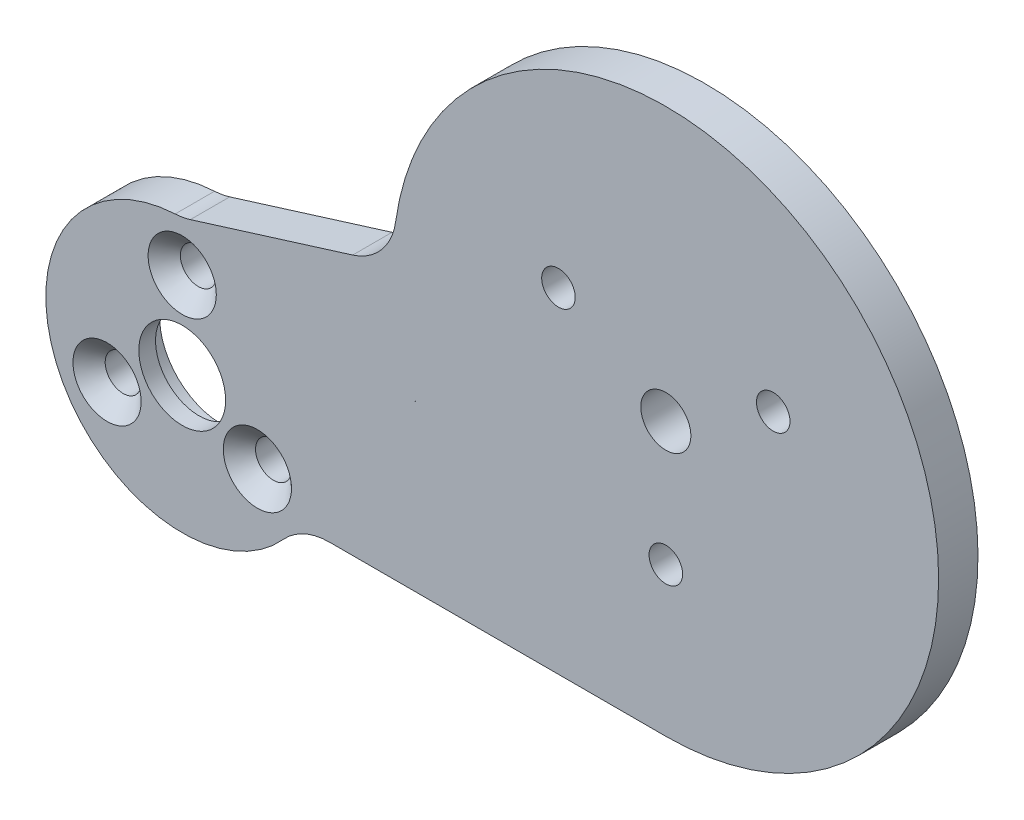
ISO-10303-21;
HEADER;
FILE_DESCRIPTION(('STEP AP214'),'2;1');
FILE_NAME('part.step','',(''),(''),'','','');
FILE_SCHEMA(('AUTOMOTIVE_DESIGN { 1 0 10303 214 1 1 1 1 }'));
ENDSEC;
DATA;
#1=APPLICATION_CONTEXT('core data for automotive mechanical design processes');
#2=APPLICATION_PROTOCOL_DEFINITION('international standard','automotive_design',2000,#1);
#3=PRODUCT_CONTEXT('',#1,'mechanical');
#4=PRODUCT('Part','Part','',(#3));
#5=PRODUCT_RELATED_PRODUCT_CATEGORY('part','',(#4));
#6=PRODUCT_DEFINITION_FORMATION('','',#4);
#7=PRODUCT_DEFINITION_CONTEXT('part definition',#1,'design');
#8=PRODUCT_DEFINITION('design','',#6,#7);
#9=PRODUCT_DEFINITION_SHAPE('','',#8);
#10=(LENGTH_UNIT() NAMED_UNIT(*) SI_UNIT(.MILLI.,.METRE.));
#11=(NAMED_UNIT(*) PLANE_ANGLE_UNIT() SI_UNIT($,.RADIAN.));
#12=(NAMED_UNIT(*) SI_UNIT($,.STERADIAN.) SOLID_ANGLE_UNIT());
#13=UNCERTAINTY_MEASURE_WITH_UNIT(LENGTH_MEASURE(1.E-05),#10,'distance_accuracy_value','');
#14=(GEOMETRIC_REPRESENTATION_CONTEXT(3) GLOBAL_UNCERTAINTY_ASSIGNED_CONTEXT((#13)) GLOBAL_UNIT_ASSIGNED_CONTEXT((#10,
#11,#12)) REPRESENTATION_CONTEXT('',''));
#15=CARTESIAN_POINT('',(0.,0.,0.));
#16=DIRECTION('',(0.,0.,1.));
#17=DIRECTION('',(1.,0.,0.));
#18=AXIS2_PLACEMENT_3D('',#15,#16,#17);
#19=CARTESIAN_POINT('',(-17.3832645273717,-89.6793573994371,0.));
#20=DIRECTION('',(0.,0.,1.));
#21=DIRECTION('',(1.,0.,0.));
#22=AXIS2_PLACEMENT_3D('',#19,#20,#21);
#23=PLANE('',#22);
#24=CARTESIAN_POINT('',(0.,0.,0.));
#25=DIRECTION('',(0.,0.,1.));
#26=DIRECTION('',(1.,0.,0.));
#27=AXIS2_PLACEMENT_3D('',#24,#25,#26);
#28=CIRCLE('',#27,22.);
#29=CARTESIAN_POINT('',(0.,-22.,0.));
#30=VERTEX_POINT('',#29);
#31=CARTESIAN_POINT('',(-21.7852816497418,3.06618711780979,0.));
#32=VERTEX_POINT('',#31);
#33=EDGE_CURVE('E166',#30,#32,#28,.T.);
#34=ORIENTED_EDGE('',*,*,#33,.F.);
#35=DIRECTION('',(-1.,0.,0.));
#36=VECTOR('',#35,1.);
#37=CARTESIAN_POINT('',(-17.3832645273717,-22.,0.));
#38=LINE('',#37,#36);
#39=CARTESIAN_POINT('',(-27.1153021330291,-22.,0.));
#40=VERTEX_POINT('',#39);
#41=EDGE_CURVE('E136',#30,#40,#38,.T.);
#42=ORIENTED_EDGE('',*,*,#41,.T.);
#43=CARTESIAN_POINT('',(-27.1153021330291,-27.,0.));
#44=DIRECTION('',(0.,0.,1.));
#45=DIRECTION('',(1.,0.,0.));
#46=AXIS2_PLACEMENT_3D('',#43,#44,#45);
#47=CIRCLE('',#46,5.);
#48=CARTESIAN_POINT('',(-30.8292702164575,-23.6523977125,0.));
#49=VERTEX_POINT('',#48);
#50=EDGE_CURVE('E188',#40,#49,#47,.T.);
#51=ORIENTED_EDGE('',*,*,#50,.T.);
#52=CARTESIAN_POINT('',(-39.,-16.28767268,0.));
#53=DIRECTION('',(0.,0.,1.));
#54=DIRECTION('',(1.,0.,0.));
#55=AXIS2_PLACEMENT_3D('',#52,#53,#54);
#56=CIRCLE('',#55,11.);
#57=CARTESIAN_POINT('',(-39.5697254592245,-5.30243654684786,0.));
#58=VERTEX_POINT('',#57);
#59=EDGE_CURVE('E139',#58,#49,#56,.T.);
#60=ORIENTED_EDGE('',*,*,#59,.F.);
#61=CARTESIAN_POINT('',(-39.8286915770539,-0.309147395415074,0.));
#62=DIRECTION('',(0.,0.,1.));
#63=DIRECTION('',(1.,0.,0.));
#64=AXIS2_PLACEMENT_3D('',#61,#62,#63);
#65=CIRCLE('',#64,5.);
#66=CARTESIAN_POINT('',(-38.3436702415299,-5.08352815453333,0.));
#67=VERTEX_POINT('',#66);
#68=EDGE_CURVE('E192',#58,#67,#65,.T.);
#69=ORIENTED_EDGE('',*,*,#68,.T.);
#70=DIRECTION('',(0.954876151823652,0.297004267104792,0.));
#71=VECTOR('',#70,1.);
#72=CARTESIAN_POINT('',(-43.2237851206375,-6.6014369852109,0.));
#73=LINE('',#72,#71);
#74=CARTESIAN_POINT('',(-25.2514606891592,-1.01133293271534,0.));
#75=VERTEX_POINT('',#74);
#76=EDGE_CURVE('E167',#67,#75,#73,.T.);
#77=ORIENTED_EDGE('',*,*,#76,.T.);
#78=CARTESIAN_POINT('',(-26.7364820246831,3.76304782640292,0.));
#79=DIRECTION('',(0.,0.,1.));
#80=DIRECTION('',(1.,0.,0.));
#81=AXIS2_PLACEMENT_3D('',#78,#79,#80);
#82=CIRCLE('',#81,5.);
#83=EDGE_CURVE('E44',#75,#32,#82,.T.);
#84=ORIENTED_EDGE('',*,*,#83,.T.);
#85=EDGE_LOOP('',(#34,#42,#51,#60,#69,#77,#84));
#86=FACE_BOUND('',#85,.T.);
#87=DIRECTION('',(0.0701321385229143,0.997537710137418,0.));
#88=VECTOR('',#87,1.);
#89=CARTESIAN_POINT('',(-25.8026304356718,-89.0874317708063,0.));
#90=LINE('',#89,#88);
#91=CARTESIAN_POINT('',(-20.1597441083789,-8.8247729663224,0.));
#92=VERTEX_POINT('',#91);
#93=CARTESIAN_POINT('',(-20.1587415560869,-8.81051297456019,0.));
#94=VERTEX_POINT('',#93);
#95=EDGE_CURVE('E119',#92,#94,#90,.T.);
#96=ORIENTED_EDGE('',*,*,#95,.T.);
#97=CARTESIAN_POINT('',(-20.3007233704013,-8.47824454934163,0.));
#98=VERTEX_POINT('',#97);
#99=EDGE_CURVE('E163',#98,#94,#28,.T.);
#100=ORIENTED_EDGE('',*,*,#99,.F.);
#101=CARTESIAN_POINT('',(-39.,-16.28767268,0.));
#102=DIRECTION('',(0.,0.,1.));
#103=DIRECTION('',(1.,0.,0.));
#104=AXIS2_PLACEMENT_3D('',#101,#102,#103);
#105=CIRCLE('',#104,20.2645037984692);
#106=EDGE_CURVE('E161',#92,#98,#105,.T.);
#107=ORIENTED_EDGE('',*,*,#106,.F.);
#108=EDGE_LOOP('',(#96,#100,#107));
#109=FACE_BOUND('',#108,.T.);
#110=CARTESIAN_POINT('',(-32.9378221735089,-19.78767268,0.));
#111=DIRECTION('',(0.,0.,1.));
#112=DIRECTION('',(1.,0.,0.));
#113=AXIS2_PLACEMENT_3D('',#110,#111,#112);
#114=CIRCLE('',#113,1.45);
#115=CARTESIAN_POINT('',(-31.4878221735089,-19.78767268,0.));
#116=VERTEX_POINT('',#115);
#117=EDGE_CURVE('E142',#116,#116,#114,.T.);
#118=ORIENTED_EDGE('',*,*,#117,.T.);
#119=EDGE_LOOP('',(#118));
#120=FACE_BOUND('',#119,.T.);
#121=CARTESIAN_POINT('',(-45.0621778264911,-19.78767268,0.));
#122=DIRECTION('',(0.,0.,1.));
#123=DIRECTION('',(1.,0.,0.));
#124=AXIS2_PLACEMENT_3D('',#121,#122,#123);
#125=CIRCLE('',#124,1.45);
#126=CARTESIAN_POINT('',(-43.612177826491,-19.78767268,0.));
#127=VERTEX_POINT('',#126);
#128=EDGE_CURVE('E554',#127,#127,#125,.T.);
#129=ORIENTED_EDGE('',*,*,#128,.T.);
#130=EDGE_LOOP('',(#129));
#131=FACE_BOUND('',#130,.T.);
#132=CARTESIAN_POINT('',(-39.,-9.28767268000001,0.));
#133=DIRECTION('',(0.,0.,1.));
#134=DIRECTION('',(1.,0.,0.));
#135=AXIS2_PLACEMENT_3D('',#132,#133,#134);
#136=CIRCLE('',#135,1.45);
#137=CARTESIAN_POINT('',(-37.55,-9.28767268000001,0.));
#138=VERTEX_POINT('',#137);
#139=EDGE_CURVE('E545',#138,#138,#136,.T.);
#140=ORIENTED_EDGE('',*,*,#139,.T.);
#141=EDGE_LOOP('',(#140));
#142=FACE_BOUND('',#141,.T.);
#143=CARTESIAN_POINT('',(0.,0.,0.));
#144=DIRECTION('',(0.,0.,1.));
#145=DIRECTION('',(1.,0.,0.));
#146=AXIS2_PLACEMENT_3D('',#143,#144,#145);
#147=CIRCLE('',#146,2.01929999999999);
#148=CARTESIAN_POINT('',(2.01929999999999,0.,0.));
#149=VERTEX_POINT('',#148);
#150=EDGE_CURVE('E536',#149,#149,#147,.T.);
#151=ORIENTED_EDGE('',*,*,#150,.T.);
#152=EDGE_LOOP('',(#151));
#153=FACE_BOUND('',#152,.T.);
#154=CARTESIAN_POINT('',(0.,-10.,0.));
#155=DIRECTION('',(0.,0.,-1.));
#156=DIRECTION('',(-1.,0.,0.));
#157=AXIS2_PLACEMENT_3D('',#154,#155,#156);
#158=CIRCLE('',#157,1.35254999999999);
#159=CARTESIAN_POINT('',(-1.35254999999999,-10.,0.));
#160=VERTEX_POINT('',#159);
#161=EDGE_CURVE('E527',#160,#160,#158,.T.);
#162=ORIENTED_EDGE('',*,*,#161,.F.);
#163=EDGE_LOOP('',(#162));
#164=FACE_BOUND('',#163,.T.);
#165=CARTESIAN_POINT('',(8.66025403784436,5.00000000000004,0.));
#166=DIRECTION('',(0.,0.,-1.));
#167=DIRECTION('',(-1.,0.,0.));
#168=AXIS2_PLACEMENT_3D('',#165,#166,#167);
#169=CIRCLE('',#168,1.35254999999999);
#170=CARTESIAN_POINT('',(7.30770403784437,5.00000000000004,0.));
#171=VERTEX_POINT('',#170);
#172=EDGE_CURVE('E521',#171,#171,#169,.T.);
#173=ORIENTED_EDGE('',*,*,#172,.F.);
#174=EDGE_LOOP('',(#173));
#175=FACE_BOUND('',#174,.T.);
#176=CARTESIAN_POINT('',(-8.66025403784436,5.00000000000004,0.));
#177=DIRECTION('',(0.,0.,-1.));
#178=DIRECTION('',(-1.,0.,0.));
#179=AXIS2_PLACEMENT_3D('',#176,#177,#178);
#180=CIRCLE('',#179,1.35254999999999);
#181=CARTESIAN_POINT('',(-10.0128040378444,5.00000000000004,0.));
#182=VERTEX_POINT('',#181);
#183=EDGE_CURVE('E509',#182,#182,#180,.T.);
#184=ORIENTED_EDGE('',*,*,#183,.F.);
#185=EDGE_LOOP('',(#184));
#186=FACE_BOUND('',#185,.T.);
#187=CARTESIAN_POINT('',(-39.,-16.28767268,0.));
#188=DIRECTION('',(0.,0.,1.));
#189=DIRECTION('',(1.,0.,0.));
#190=AXIS2_PLACEMENT_3D('',#187,#188,#189);
#191=CIRCLE('',#190,5.);
#192=CARTESIAN_POINT('',(-34.,-16.28767268,0.));
#193=VERTEX_POINT('',#192);
#194=EDGE_CURVE('E514',#193,#193,#191,.T.);
#195=ORIENTED_EDGE('',*,*,#194,.T.);
#196=EDGE_LOOP('',(#195));
#197=FACE_BOUND('',#196,.T.);
#198=ADVANCED_FACE('F36',(#86,#109,#120,#131,#142,#153,#164,#175,#186,#197),#23,.F.);
#199=CARTESIAN_POINT('',(0.,0.,3.175));
#200=DIRECTION('',(0.,0.,-1.));
#201=DIRECTION('',(-1.,0.,0.));
#202=AXIS2_PLACEMENT_3D('',#199,#200,#201);
#203=CYLINDRICAL_SURFACE('',#202,22.);
#204=ORIENTED_EDGE('',*,*,#33,.T.);
#205=DIRECTION('',(0.,0.,-1.));
#206=VECTOR('',#205,1.);
#207=CARTESIAN_POINT('',(-21.7852816497418,3.06618711780979,3.175));
#208=LINE('',#207,#206);
#209=CARTESIAN_POINT('',(-21.7852816497418,3.06618711780979,3.175));
#210=VERTEX_POINT('',#209);
#211=EDGE_CURVE('E51',#32,#210,#208,.F.);
#212=ORIENTED_EDGE('',*,*,#211,.T.);
#213=CARTESIAN_POINT('',(0.,0.,3.175));
#214=DIRECTION('',(0.,0.,1.));
#215=DIRECTION('',(1.,0.,0.));
#216=AXIS2_PLACEMENT_3D('',#213,#214,#215);
#217=CIRCLE('',#216,22.);
#218=CARTESIAN_POINT('',(0.,-22.,3.175));
#219=VERTEX_POINT('',#218);
#220=EDGE_CURVE('E146',#219,#210,#217,.T.);
#221=ORIENTED_EDGE('',*,*,#220,.F.);
#222=DIRECTION('',(0.,0.,-1.));
#223=VECTOR('',#222,1.);
#224=CARTESIAN_POINT('',(0.,-22.,3.175));
#225=LINE('',#224,#223);
#226=EDGE_CURVE('E122',#219,#30,#225,.T.);
#227=ORIENTED_EDGE('',*,*,#226,.T.);
#228=EDGE_LOOP('',(#204,#212,#221,#227));
#229=FACE_BOUND('',#228,.T.);
#230=ADVANCED_FACE('F216',(#229),#203,.T.);
#231=CARTESIAN_POINT('',(-43.2237851206375,-6.6014369852109,3.175));
#232=DIRECTION('',(-0.297004267104792,0.954876151823652,0.));
#233=DIRECTION('',(-0.954876151823652,-0.297004267104792,0.));
#234=AXIS2_PLACEMENT_3D('',#231,#232,#233);
#235=PLANE('',#234);
#236=ORIENTED_EDGE('',*,*,#76,.F.);
#237=DIRECTION('',(0.,0.,-1.));
#238=VECTOR('',#237,1.);
#239=CARTESIAN_POINT('',(-38.3436702415299,-5.08352815453333,3.175));
#240=LINE('',#239,#238);
#241=CARTESIAN_POINT('',(-38.3436702415299,-5.08352815453333,3.175));
#242=VERTEX_POINT('',#241);
#243=EDGE_CURVE('E185',#67,#242,#240,.F.);
#244=ORIENTED_EDGE('',*,*,#243,.T.);
#245=DIRECTION('',(0.954876151823652,0.297004267104792,0.));
#246=VECTOR('',#245,1.);
#247=CARTESIAN_POINT('',(-43.2237851206375,-6.6014369852109,3.175));
#248=LINE('',#247,#246);
#249=CARTESIAN_POINT('',(-25.2514606891592,-1.01133293271534,3.175));
#250=VERTEX_POINT('',#249);
#251=EDGE_CURVE('E147',#242,#250,#248,.T.);
#252=ORIENTED_EDGE('',*,*,#251,.T.);
#253=DIRECTION('',(0.,0.,-1.));
#254=VECTOR('',#253,1.);
#255=CARTESIAN_POINT('',(-25.2514606891592,-1.01133293271534,3.175));
#256=LINE('',#255,#254);
#257=EDGE_CURVE('E182',#250,#75,#256,.T.);
#258=ORIENTED_EDGE('',*,*,#257,.T.);
#259=EDGE_LOOP('',(#236,#244,#252,#258));
#260=FACE_BOUND('',#259,.T.);
#261=ADVANCED_FACE('F211',(#260),#235,.T.);
#262=CARTESIAN_POINT('',(-39.,-16.28767268,3.175));
#263=DIRECTION('',(0.,0.,-1.));
#264=DIRECTION('',(-1.,0.,0.));
#265=AXIS2_PLACEMENT_3D('',#262,#263,#264);
#266=CYLINDRICAL_SURFACE('',#265,11.);
#267=ORIENTED_EDGE('',*,*,#59,.T.);
#268=DIRECTION('',(0.,0.,-1.));
#269=VECTOR('',#268,1.);
#270=CARTESIAN_POINT('',(-30.8292702164575,-23.6523977125,3.175));
#271=LINE('',#270,#269);
#272=CARTESIAN_POINT('',(-30.8292702164575,-23.6523977125,3.175));
#273=VERTEX_POINT('',#272);
#274=EDGE_CURVE('E180',#49,#273,#271,.F.);
#275=ORIENTED_EDGE('',*,*,#274,.T.);
#276=CARTESIAN_POINT('',(-39.,-16.28767268,3.175));
#277=DIRECTION('',(0.,0.,1.));
#278=DIRECTION('',(1.,0.,0.));
#279=AXIS2_PLACEMENT_3D('',#276,#277,#278);
#280=CIRCLE('',#279,11.);
#281=CARTESIAN_POINT('',(-39.5697254592245,-5.30243654684786,3.175));
#282=VERTEX_POINT('',#281);
#283=EDGE_CURVE('E150',#282,#273,#280,.T.);
#284=ORIENTED_EDGE('',*,*,#283,.F.);
#285=DIRECTION('',(0.,0.,-1.));
#286=VECTOR('',#285,1.);
#287=CARTESIAN_POINT('',(-39.5697254592245,-5.30243654684786,3.175));
#288=LINE('',#287,#286);
#289=EDGE_CURVE('E177',#282,#58,#288,.T.);
#290=ORIENTED_EDGE('',*,*,#289,.T.);
#291=EDGE_LOOP('',(#267,#275,#284,#290));
#292=FACE_BOUND('',#291,.T.);
#293=ADVANCED_FACE('F204',(#292),#266,.T.);
#294=CARTESIAN_POINT('',(-25.8026304356718,-89.0874317708063,3.175));
#295=DIRECTION('',(-0.997537710137418,0.0701321385229143,0.));
#296=DIRECTION('',(-0.0701321385229143,-0.997537710137418,0.));
#297=AXIS2_PLACEMENT_3D('',#294,#295,#296);
#298=PLANE('',#297);
#299=ORIENTED_EDGE('',*,*,#95,.F.);
#300=DIRECTION('',(0.,0.,-1.));
#301=VECTOR('',#300,1.);
#302=CARTESIAN_POINT('',(-20.1597441083789,-8.8247729663224,3.175));
#303=LINE('',#302,#301);
#304=CARTESIAN_POINT('',(-20.1597441083789,-8.8247729663224,3.175));
#305=VERTEX_POINT('',#304);
#306=EDGE_CURVE('E113',#305,#92,#303,.T.);
#307=ORIENTED_EDGE('',*,*,#306,.F.);
#308=DIRECTION('',(0.0701321385229143,0.997537710137418,0.));
#309=VECTOR('',#308,1.);
#310=CARTESIAN_POINT('',(-25.8026304356718,-89.0874317708063,3.175));
#311=LINE('',#310,#309);
#312=CARTESIAN_POINT('',(-20.1587415560869,-8.81051297456019,3.175));
#313=VERTEX_POINT('',#312);
#314=EDGE_CURVE('E117',#305,#313,#311,.T.);
#315=ORIENTED_EDGE('',*,*,#314,.T.);
#316=DIRECTION('',(0.,0.,-1.));
#317=VECTOR('',#316,1.);
#318=CARTESIAN_POINT('',(-20.1587415560869,-8.81051297456019,3.175));
#319=LINE('',#318,#317);
#320=EDGE_CURVE('E159',#313,#94,#319,.T.);
#321=ORIENTED_EDGE('',*,*,#320,.T.);
#322=EDGE_LOOP('',(#299,#307,#315,#321));
#323=FACE_BOUND('',#322,.T.);
#324=ADVANCED_FACE('F115',(#323),#298,.T.);
#325=CARTESIAN_POINT('',(-39.,-16.28767268,3.175));
#326=DIRECTION('',(0.,0.,-1.));
#327=DIRECTION('',(-1.,0.,0.));
#328=AXIS2_PLACEMENT_3D('',#325,#326,#327);
#329=CYLINDRICAL_SURFACE('',#328,20.2645037984692);
#330=ORIENTED_EDGE('',*,*,#106,.T.);
#331=DIRECTION('',(0.,0.,-1.));
#332=VECTOR('',#331,1.);
#333=CARTESIAN_POINT('',(-20.3007233704013,-8.47824454934163,3.175));
#334=LINE('',#333,#332);
#335=CARTESIAN_POINT('',(-20.3007233704013,-8.47824454934163,3.175));
#336=VERTEX_POINT('',#335);
#337=EDGE_CURVE('E123',#336,#98,#334,.T.);
#338=ORIENTED_EDGE('',*,*,#337,.F.);
#339=CARTESIAN_POINT('',(-39.,-16.28767268,3.175));
#340=DIRECTION('',(0.,0.,1.));
#341=DIRECTION('',(1.,0.,0.));
#342=AXIS2_PLACEMENT_3D('',#339,#340,#341);
#343=CIRCLE('',#342,20.2645037984692);
#344=EDGE_CURVE('E126',#305,#336,#343,.T.);
#345=ORIENTED_EDGE('',*,*,#344,.F.);
#346=ORIENTED_EDGE('',*,*,#306,.T.);
#347=EDGE_LOOP('',(#330,#338,#345,#346));
#348=FACE_BOUND('',#347,.T.);
#349=ADVANCED_FACE('F127',(#348),#329,.T.);
#350=CARTESIAN_POINT('',(-17.3832645273717,-22.,3.175));
#351=DIRECTION('',(0.,-1.,0.));
#352=DIRECTION('',(0.,0.,-1.));
#353=AXIS2_PLACEMENT_3D('',#350,#351,#352);
#354=PLANE('',#353);
#355=DIRECTION('',(-1.,0.,0.));
#356=VECTOR('',#355,1.);
#357=CARTESIAN_POINT('',(-17.3832645273717,-22.,3.175));
#358=LINE('',#357,#356);
#359=CARTESIAN_POINT('',(-27.1153021330291,-22.,3.175));
#360=VERTEX_POINT('',#359);
#361=EDGE_CURVE('E153',#219,#360,#358,.T.);
#362=ORIENTED_EDGE('',*,*,#361,.T.);
#363=DIRECTION('',(0.,0.,-1.));
#364=VECTOR('',#363,1.);
#365=CARTESIAN_POINT('',(-27.1153021330291,-22.,3.175));
#366=LINE('',#365,#364);
#367=EDGE_CURVE('E172',#360,#40,#366,.T.);
#368=ORIENTED_EDGE('',*,*,#367,.T.);
#369=ORIENTED_EDGE('',*,*,#41,.F.);
#370=ORIENTED_EDGE('',*,*,#226,.F.);
#371=EDGE_LOOP('',(#362,#368,#369,#370));
#372=FACE_BOUND('',#371,.T.);
#373=ADVANCED_FACE('F219',(#372),#354,.T.);
#374=ORIENTED_EDGE('',*,*,#99,.T.);
#375=ORIENTED_EDGE('',*,*,#320,.F.);
#376=EDGE_CURVE('E131',#336,#313,#217,.T.);
#377=ORIENTED_EDGE('',*,*,#376,.F.);
#378=ORIENTED_EDGE('',*,*,#337,.T.);
#379=EDGE_LOOP('',(#374,#375,#377,#378));
#380=FACE_BOUND('',#379,.T.);
#381=ADVANCED_FACE('F240',(#380),#203,.T.);
#382=CARTESIAN_POINT('',(-39.,-16.28767268,3.175));
#383=DIRECTION('',(0.,0.,-1.));
#384=DIRECTION('',(-1.,0.,0.));
#385=AXIS2_PLACEMENT_3D('',#382,#383,#384);
#386=CYLINDRICAL_SURFACE('',#385,3.50012);
#387=CARTESIAN_POINT('',(-39.,-16.28767268,1.82626));
#388=DIRECTION('',(0.,0.,1.));
#389=DIRECTION('',(1.,0.,0.));
#390=AXIS2_PLACEMENT_3D('',#387,#388,#389);
#391=CIRCLE('',#390,3.50012);
#392=CARTESIAN_POINT('',(-35.49988,-16.28767268,1.82626));
#393=VERTEX_POINT('',#392);
#394=EDGE_CURVE('E505',#393,#393,#391,.T.);
#395=ORIENTED_EDGE('',*,*,#394,.F.);
#396=EDGE_LOOP('',(#395));
#397=FACE_BOUND('',#396,.T.);
#398=CARTESIAN_POINT('',(-39.,-16.28767268,3.175));
#399=DIRECTION('',(0.,0.,1.));
#400=DIRECTION('',(1.,0.,0.));
#401=AXIS2_PLACEMENT_3D('',#398,#399,#400);
#402=CIRCLE('',#401,3.50012);
#403=CARTESIAN_POINT('',(-35.49988,-16.28767268,3.175));
#404=VERTEX_POINT('',#403);
#405=EDGE_CURVE('E156',#404,#404,#402,.T.);
#406=ORIENTED_EDGE('',*,*,#405,.T.);
#407=EDGE_LOOP('',(#406));
#408=FACE_BOUND('',#407,.T.);
#409=ADVANCED_FACE('F244',(#397,#408),#386,.F.);
#410=CARTESIAN_POINT('',(-17.3832645273717,-89.6793573994371,3.175));
#411=DIRECTION('',(0.,0.,1.));
#412=DIRECTION('',(1.,0.,0.));
#413=AXIS2_PLACEMENT_3D('',#410,#411,#412);
#414=PLANE('',#413);
#415=CARTESIAN_POINT('',(-8.66025403784436,5.00000000000004,3.175));
#416=DIRECTION('',(0.,0.,1.));
#417=DIRECTION('',(1.,0.,0.));
#418=AXIS2_PLACEMENT_3D('',#415,#416,#417);
#419=CIRCLE('',#418,1.35254999999999);
#420=CARTESIAN_POINT('',(-7.30770403784438,5.00000000000004,3.175));
#421=VERTEX_POINT('',#420);
#422=EDGE_CURVE('E512',#421,#421,#419,.T.);
#423=ORIENTED_EDGE('',*,*,#422,.F.);
#424=EDGE_LOOP('',(#423));
#425=FACE_BOUND('',#424,.T.);
#426=CARTESIAN_POINT('',(8.66025403784436,5.00000000000004,3.175));
#427=DIRECTION('',(0.,0.,1.));
#428=DIRECTION('',(1.,0.,0.));
#429=AXIS2_PLACEMENT_3D('',#426,#427,#428);
#430=CIRCLE('',#429,1.35254999999999);
#431=CARTESIAN_POINT('',(10.0128040378444,5.00000000000004,3.175));
#432=VERTEX_POINT('',#431);
#433=EDGE_CURVE('E524',#432,#432,#430,.T.);
#434=ORIENTED_EDGE('',*,*,#433,.F.);
#435=EDGE_LOOP('',(#434));
#436=FACE_BOUND('',#435,.T.);
#437=CARTESIAN_POINT('',(0.,-10.,3.175));
#438=DIRECTION('',(0.,0.,1.));
#439=DIRECTION('',(1.,0.,0.));
#440=AXIS2_PLACEMENT_3D('',#437,#438,#439);
#441=CIRCLE('',#440,1.35254999999999);
#442=CARTESIAN_POINT('',(1.35254999999999,-10.,3.175));
#443=VERTEX_POINT('',#442);
#444=EDGE_CURVE('E530',#443,#443,#441,.T.);
#445=ORIENTED_EDGE('',*,*,#444,.F.);
#446=EDGE_LOOP('',(#445));
#447=FACE_BOUND('',#446,.T.);
#448=CARTESIAN_POINT('',(0.,0.,3.175));
#449=DIRECTION('',(0.,0.,1.));
#450=DIRECTION('',(1.,0.,0.));
#451=AXIS2_PLACEMENT_3D('',#448,#449,#450);
#452=CIRCLE('',#451,2.01929999999999);
#453=CARTESIAN_POINT('',(2.01929999999999,0.,3.175));
#454=VERTEX_POINT('',#453);
#455=EDGE_CURVE('E533',#454,#454,#452,.T.);
#456=ORIENTED_EDGE('',*,*,#455,.F.);
#457=EDGE_LOOP('',(#456));
#458=FACE_BOUND('',#457,.T.);
#459=CARTESIAN_POINT('',(-39.,-9.28767268000001,3.175));
#460=DIRECTION('',(0.,0.,1.));
#461=DIRECTION('',(1.,0.,0.));
#462=AXIS2_PLACEMENT_3D('',#459,#460,#461);
#463=CIRCLE('',#462,2.75);
#464=CARTESIAN_POINT('',(-36.25,-9.28767268000001,3.175));
#465=VERTEX_POINT('',#464);
#466=EDGE_CURVE('E539',#465,#465,#463,.T.);
#467=ORIENTED_EDGE('',*,*,#466,.F.);
#468=EDGE_LOOP('',(#467));
#469=FACE_BOUND('',#468,.T.);
#470=CARTESIAN_POINT('',(-45.0621778264911,-19.78767268,3.175));
#471=DIRECTION('',(0.,0.,1.));
#472=DIRECTION('',(1.,0.,0.));
#473=AXIS2_PLACEMENT_3D('',#470,#471,#472);
#474=CIRCLE('',#473,2.75);
#475=CARTESIAN_POINT('',(-42.3121778264911,-19.78767268,3.175));
#476=VERTEX_POINT('',#475);
#477=EDGE_CURVE('E548',#476,#476,#474,.T.);
#478=ORIENTED_EDGE('',*,*,#477,.F.);
#479=EDGE_LOOP('',(#478));
#480=FACE_BOUND('',#479,.T.);
#481=CARTESIAN_POINT('',(-32.9378221735089,-19.78767268,3.175));
#482=DIRECTION('',(0.,0.,1.));
#483=DIRECTION('',(1.,0.,0.));
#484=AXIS2_PLACEMENT_3D('',#481,#482,#483);
#485=CIRCLE('',#484,2.75);
#486=CARTESIAN_POINT('',(-30.1878221735089,-19.78767268,3.175));
#487=VERTEX_POINT('',#486);
#488=EDGE_CURVE('E557',#487,#487,#485,.T.);
#489=ORIENTED_EDGE('',*,*,#488,.F.);
#490=EDGE_LOOP('',(#489));
#491=FACE_BOUND('',#490,.T.);
#492=ORIENTED_EDGE('',*,*,#314,.F.);
#493=ORIENTED_EDGE('',*,*,#344,.T.);
#494=ORIENTED_EDGE('',*,*,#376,.T.);
#495=EDGE_LOOP('',(#492,#493,#494));
#496=FACE_BOUND('',#495,.T.);
#497=ORIENTED_EDGE('',*,*,#220,.T.);
#498=CARTESIAN_POINT('',(-26.7364820246831,3.76304782640292,3.175));
#499=DIRECTION('',(0.,0.,1.));
#500=DIRECTION('',(1.,0.,0.));
#501=AXIS2_PLACEMENT_3D('',#498,#499,#500);
#502=CIRCLE('',#501,5.);
#503=EDGE_CURVE('E11',#210,#250,#502,.F.);
#504=ORIENTED_EDGE('',*,*,#503,.T.);
#505=ORIENTED_EDGE('',*,*,#251,.F.);
#506=CARTESIAN_POINT('',(-39.8286915770539,-0.309147395415074,3.175));
#507=DIRECTION('',(0.,0.,1.));
#508=DIRECTION('',(1.,0.,0.));
#509=AXIS2_PLACEMENT_3D('',#506,#507,#508);
#510=CIRCLE('',#509,5.);
#511=EDGE_CURVE('E194',#242,#282,#510,.F.);
#512=ORIENTED_EDGE('',*,*,#511,.T.);
#513=ORIENTED_EDGE('',*,*,#283,.T.);
#514=CARTESIAN_POINT('',(-27.1153021330291,-27.,3.175));
#515=DIRECTION('',(0.,0.,1.));
#516=DIRECTION('',(1.,0.,0.));
#517=AXIS2_PLACEMENT_3D('',#514,#515,#516);
#518=CIRCLE('',#517,5.);
#519=EDGE_CURVE('E190',#273,#360,#518,.F.);
#520=ORIENTED_EDGE('',*,*,#519,.T.);
#521=ORIENTED_EDGE('',*,*,#361,.F.);
#522=EDGE_LOOP('',(#497,#504,#505,#512,#513,#520,#521));
#523=FACE_BOUND('',#522,.T.);
#524=ORIENTED_EDGE('',*,*,#405,.F.);
#525=EDGE_LOOP('',(#524));
#526=FACE_BOUND('',#525,.T.);
#527=ADVANCED_FACE('F133',(#425,#436,#447,#458,#469,#480,#491,#496,#523,#526),#414,.T.);
#528=CARTESIAN_POINT('',(-32.9378221735089,-19.78767268,3.175));
#529=DIRECTION('',(0.,0.,1.));
#530=DIRECTION('',(1.,0.,0.));
#531=AXIS2_PLACEMENT_3D('',#528,#529,#530);
#532=CYLINDRICAL_SURFACE('',#531,1.45);
#533=ORIENTED_EDGE('',*,*,#117,.F.);
#534=EDGE_LOOP('',(#533));
#535=FACE_BOUND('',#534,.T.);
#536=CARTESIAN_POINT('',(-32.9378221735089,-19.78767268,1.875));
#537=DIRECTION('',(0.,0.,1.));
#538=DIRECTION('',(1.,0.,0.));
#539=AXIS2_PLACEMENT_3D('',#536,#537,#538);
#540=CIRCLE('',#539,1.45);
#541=CARTESIAN_POINT('',(-31.4878221735089,-19.78767268,1.875));
#542=VERTEX_POINT('',#541);
#543=EDGE_CURVE('E559',#542,#542,#540,.T.);
#544=ORIENTED_EDGE('',*,*,#543,.T.);
#545=EDGE_LOOP('',(#544));
#546=FACE_BOUND('',#545,.T.);
#547=ADVANCED_FACE('F286',(#535,#546),#532,.F.);
#548=CARTESIAN_POINT('',(-32.9378221735089,-19.78767268,3.175));
#549=DIRECTION('',(0.,0.,1.));
#550=DIRECTION('',(1.,0.,0.));
#551=AXIS2_PLACEMENT_3D('',#548,#549,#550);
#552=CONICAL_SURFACE('',#551,2.75,0.785398163397448);
#553=ORIENTED_EDGE('',*,*,#543,.F.);
#554=EDGE_LOOP('',(#553));
#555=FACE_BOUND('',#554,.T.);
#556=ORIENTED_EDGE('',*,*,#488,.T.);
#557=EDGE_LOOP('',(#556));
#558=FACE_BOUND('',#557,.T.);
#559=ADVANCED_FACE('F294',(#555,#558),#552,.F.);
#560=CARTESIAN_POINT('',(-45.0621778264911,-19.78767268,3.175));
#561=DIRECTION('',(0.,0.,1.));
#562=DIRECTION('',(1.,0.,0.));
#563=AXIS2_PLACEMENT_3D('',#560,#561,#562);
#564=CYLINDRICAL_SURFACE('',#563,1.45);
#565=ORIENTED_EDGE('',*,*,#128,.F.);
#566=EDGE_LOOP('',(#565));
#567=FACE_BOUND('',#566,.T.);
#568=CARTESIAN_POINT('',(-45.0621778264911,-19.78767268,1.875));
#569=DIRECTION('',(0.,0.,1.));
#570=DIRECTION('',(1.,0.,0.));
#571=AXIS2_PLACEMENT_3D('',#568,#569,#570);
#572=CIRCLE('',#571,1.45);
#573=CARTESIAN_POINT('',(-43.612177826491,-19.78767268,1.875));
#574=VERTEX_POINT('',#573);
#575=EDGE_CURVE('E551',#574,#574,#572,.T.);
#576=ORIENTED_EDGE('',*,*,#575,.T.);
#577=EDGE_LOOP('',(#576));
#578=FACE_BOUND('',#577,.T.);
#579=ADVANCED_FACE('F301',(#567,#578),#564,.F.);
#580=CARTESIAN_POINT('',(-45.0621778264911,-19.78767268,3.175));
#581=DIRECTION('',(0.,0.,1.));
#582=DIRECTION('',(1.,0.,0.));
#583=AXIS2_PLACEMENT_3D('',#580,#581,#582);
#584=CONICAL_SURFACE('',#583,2.75,0.785398163397449);
#585=ORIENTED_EDGE('',*,*,#575,.F.);
#586=EDGE_LOOP('',(#585));
#587=FACE_BOUND('',#586,.T.);
#588=ORIENTED_EDGE('',*,*,#477,.T.);
#589=EDGE_LOOP('',(#588));
#590=FACE_BOUND('',#589,.T.);
#591=ADVANCED_FACE('F309',(#587,#590),#584,.F.);
#592=CARTESIAN_POINT('',(-39.,-9.28767268000001,3.175));
#593=DIRECTION('',(0.,0.,1.));
#594=DIRECTION('',(1.,0.,0.));
#595=AXIS2_PLACEMENT_3D('',#592,#593,#594);
#596=CYLINDRICAL_SURFACE('',#595,1.45);
#597=ORIENTED_EDGE('',*,*,#139,.F.);
#598=EDGE_LOOP('',(#597));
#599=FACE_BOUND('',#598,.T.);
#600=CARTESIAN_POINT('',(-39.,-9.28767268000001,1.875));
#601=DIRECTION('',(0.,0.,1.));
#602=DIRECTION('',(1.,0.,0.));
#603=AXIS2_PLACEMENT_3D('',#600,#601,#602);
#604=CIRCLE('',#603,1.45);
#605=CARTESIAN_POINT('',(-37.55,-9.28767268000001,1.875));
#606=VERTEX_POINT('',#605);
#607=EDGE_CURVE('E542',#606,#606,#604,.T.);
#608=ORIENTED_EDGE('',*,*,#607,.T.);
#609=EDGE_LOOP('',(#608));
#610=FACE_BOUND('',#609,.T.);
#611=ADVANCED_FACE('F230',(#599,#610),#596,.F.);
#612=CARTESIAN_POINT('',(-39.,-9.28767268000001,3.175));
#613=DIRECTION('',(0.,0.,1.));
#614=DIRECTION('',(1.,0.,0.));
#615=AXIS2_PLACEMENT_3D('',#612,#613,#614);
#616=CONICAL_SURFACE('',#615,2.75,0.785398163397449);
#617=ORIENTED_EDGE('',*,*,#607,.F.);
#618=EDGE_LOOP('',(#617));
#619=FACE_BOUND('',#618,.T.);
#620=ORIENTED_EDGE('',*,*,#466,.T.);
#621=EDGE_LOOP('',(#620));
#622=FACE_BOUND('',#621,.T.);
#623=ADVANCED_FACE('F224',(#619,#622),#616,.F.);
#624=CARTESIAN_POINT('',(-27.1153021330291,-27.,3.175));
#625=DIRECTION('',(0.,0.,-1.));
#626=DIRECTION('',(-1.,0.,0.));
#627=AXIS2_PLACEMENT_3D('',#624,#625,#626);
#628=CYLINDRICAL_SURFACE('',#627,5.);
#629=ORIENTED_EDGE('',*,*,#519,.F.);
#630=ORIENTED_EDGE('',*,*,#274,.F.);
#631=ORIENTED_EDGE('',*,*,#50,.F.);
#632=ORIENTED_EDGE('',*,*,#367,.F.);
#633=EDGE_LOOP('',(#629,#630,#631,#632));
#634=FACE_BOUND('',#633,.T.);
#635=ADVANCED_FACE('F222',(#634),#628,.F.);
#636=CARTESIAN_POINT('',(-39.8286915770539,-0.309147395415074,3.175));
#637=DIRECTION('',(0.,0.,-1.));
#638=DIRECTION('',(-1.,0.,0.));
#639=AXIS2_PLACEMENT_3D('',#636,#637,#638);
#640=CYLINDRICAL_SURFACE('',#639,5.);
#641=ORIENTED_EDGE('',*,*,#511,.F.);
#642=ORIENTED_EDGE('',*,*,#243,.F.);
#643=ORIENTED_EDGE('',*,*,#68,.F.);
#644=ORIENTED_EDGE('',*,*,#289,.F.);
#645=EDGE_LOOP('',(#641,#642,#643,#644));
#646=FACE_BOUND('',#645,.T.);
#647=ADVANCED_FACE('F207',(#646),#640,.F.);
#648=CARTESIAN_POINT('',(-26.7364820246831,3.76304782640292,3.175));
#649=DIRECTION('',(0.,0.,-1.));
#650=DIRECTION('',(-1.,0.,0.));
#651=AXIS2_PLACEMENT_3D('',#648,#649,#650);
#652=CYLINDRICAL_SURFACE('',#651,5.);
#653=ORIENTED_EDGE('',*,*,#503,.F.);
#654=ORIENTED_EDGE('',*,*,#211,.F.);
#655=ORIENTED_EDGE('',*,*,#83,.F.);
#656=ORIENTED_EDGE('',*,*,#257,.F.);
#657=EDGE_LOOP('',(#653,#654,#655,#656));
#658=FACE_BOUND('',#657,.T.);
#659=ADVANCED_FACE('F38',(#658),#652,.F.);
#660=CARTESIAN_POINT('',(0.,0.,3.175));
#661=DIRECTION('',(0.,0.,1.));
#662=DIRECTION('',(1.,0.,0.));
#663=AXIS2_PLACEMENT_3D('',#660,#661,#662);
#664=CYLINDRICAL_SURFACE('',#663,2.01929999999999);
#665=ORIENTED_EDGE('',*,*,#455,.T.);
#666=EDGE_LOOP('',(#665));
#667=FACE_BOUND('',#666,.T.);
#668=ORIENTED_EDGE('',*,*,#150,.F.);
#669=EDGE_LOOP('',(#668));
#670=FACE_BOUND('',#669,.T.);
#671=ADVANCED_FACE('F410',(#667,#670),#664,.F.);
#672=CARTESIAN_POINT('',(0.,-10.,0.));
#673=DIRECTION('',(0.,0.,-1.));
#674=DIRECTION('',(-1.,0.,0.));
#675=AXIS2_PLACEMENT_3D('',#672,#673,#674);
#676=CYLINDRICAL_SURFACE('',#675,1.35254999999999);
#677=ORIENTED_EDGE('',*,*,#444,.T.);
#678=EDGE_LOOP('',(#677));
#679=FACE_BOUND('',#678,.T.);
#680=ORIENTED_EDGE('',*,*,#161,.T.);
#681=EDGE_LOOP('',(#680));
#682=FACE_BOUND('',#681,.T.);
#683=ADVANCED_FACE('F416',(#679,#682),#676,.F.);
#684=CARTESIAN_POINT('',(8.66025403784436,5.00000000000004,0.));
#685=DIRECTION('',(0.,0.,-1.));
#686=DIRECTION('',(-1.,0.,0.));
#687=AXIS2_PLACEMENT_3D('',#684,#685,#686);
#688=CYLINDRICAL_SURFACE('',#687,1.35254999999999);
#689=ORIENTED_EDGE('',*,*,#433,.T.);
#690=EDGE_LOOP('',(#689));
#691=FACE_BOUND('',#690,.T.);
#692=ORIENTED_EDGE('',*,*,#172,.T.);
#693=EDGE_LOOP('',(#692));
#694=FACE_BOUND('',#693,.T.);
#695=ADVANCED_FACE('F425',(#691,#694),#688,.F.);
#696=CARTESIAN_POINT('',(-8.66025403784436,5.00000000000004,0.));
#697=DIRECTION('',(0.,0.,-1.));
#698=DIRECTION('',(-1.,0.,0.));
#699=AXIS2_PLACEMENT_3D('',#696,#697,#698);
#700=CYLINDRICAL_SURFACE('',#699,1.35254999999999);
#701=ORIENTED_EDGE('',*,*,#422,.T.);
#702=EDGE_LOOP('',(#701));
#703=FACE_BOUND('',#702,.T.);
#704=ORIENTED_EDGE('',*,*,#183,.T.);
#705=EDGE_LOOP('',(#704));
#706=FACE_BOUND('',#705,.T.);
#707=ADVANCED_FACE('F435',(#703,#706),#700,.F.);
#708=CARTESIAN_POINT('',(-39.,-16.28767268,1.82626));
#709=DIRECTION('',(0.,0.,-1.));
#710=DIRECTION('',(-1.,0.,0.));
#711=AXIS2_PLACEMENT_3D('',#708,#709,#710);
#712=CYLINDRICAL_SURFACE('',#711,5.);
#713=CARTESIAN_POINT('',(-39.,-16.28767268,1.82626));
#714=DIRECTION('',(0.,0.,1.));
#715=DIRECTION('',(1.,0.,0.));
#716=AXIS2_PLACEMENT_3D('',#713,#714,#715);
#717=CIRCLE('',#716,5.);
#718=CARTESIAN_POINT('',(-34.,-16.28767268,1.82626));
#719=VERTEX_POINT('',#718);
#720=EDGE_CURVE('E508',#719,#719,#717,.T.);
#721=ORIENTED_EDGE('',*,*,#720,.T.);
#722=EDGE_LOOP('',(#721));
#723=FACE_BOUND('',#722,.T.);
#724=ORIENTED_EDGE('',*,*,#194,.F.);
#725=EDGE_LOOP('',(#724));
#726=FACE_BOUND('',#725,.T.);
#727=ADVANCED_FACE('F445',(#723,#726),#712,.F.);
#728=CARTESIAN_POINT('',(-17.3832645273717,-89.6793573994371,1.82626));
#729=DIRECTION('',(0.,0.,1.));
#730=DIRECTION('',(1.,0.,0.));
#731=AXIS2_PLACEMENT_3D('',#728,#729,#730);
#732=PLANE('',#731);
#733=ORIENTED_EDGE('',*,*,#394,.T.);
#734=EDGE_LOOP('',(#733));
#735=FACE_BOUND('',#734,.T.);
#736=ORIENTED_EDGE('',*,*,#720,.F.);
#737=EDGE_LOOP('',(#736));
#738=FACE_BOUND('',#737,.T.);
#739=ADVANCED_FACE('F479',(#735,#738),#732,.F.);
#740=CLOSED_SHELL('',(#198,#230,#261,#293,#324,#349,#373,#381,#409,#527,#547,#559,#579,#591,
#611,#623,#635,#647,#659,#671,#683,#695,#707,#727,#739));
#741=MANIFOLD_SOLID_BREP('B2',#740);
#742=ADVANCED_BREP_SHAPE_REPRESENTATION('',(#18,#741),#14);
#743=SHAPE_DEFINITION_REPRESENTATION(#9,#742);
ENDSEC;
END-ISO-10303-21;
